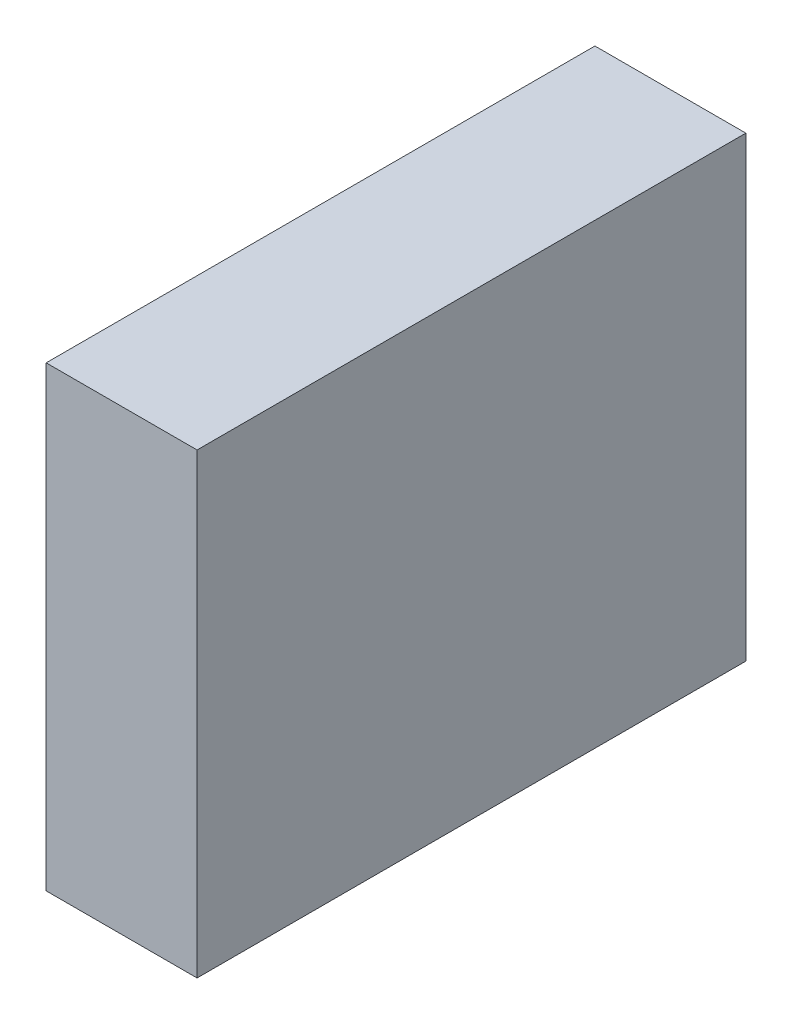
ISO-10303-21;
HEADER;
FILE_DESCRIPTION(('STEP AP214'),'2;1');
FILE_NAME('part.step','',(''),(''),'','','');
FILE_SCHEMA(('AUTOMOTIVE_DESIGN { 1 0 10303 214 1 1 1 1 }'));
ENDSEC;
DATA;
#1=APPLICATION_CONTEXT('core data for automotive mechanical design processes');
#2=APPLICATION_PROTOCOL_DEFINITION('international standard','automotive_design',2000,#1);
#3=PRODUCT_CONTEXT('',#1,'mechanical');
#4=PRODUCT('Part','Part','',(#3));
#5=PRODUCT_RELATED_PRODUCT_CATEGORY('part','',(#4));
#6=PRODUCT_DEFINITION_FORMATION('','',#4);
#7=PRODUCT_DEFINITION_CONTEXT('part definition',#1,'design');
#8=PRODUCT_DEFINITION('design','',#6,#7);
#9=PRODUCT_DEFINITION_SHAPE('','',#8);
#10=(LENGTH_UNIT() NAMED_UNIT(*) SI_UNIT(.MILLI.,.METRE.));
#11=(NAMED_UNIT(*) PLANE_ANGLE_UNIT() SI_UNIT($,.RADIAN.));
#12=(NAMED_UNIT(*) SI_UNIT($,.STERADIAN.) SOLID_ANGLE_UNIT());
#13=UNCERTAINTY_MEASURE_WITH_UNIT(LENGTH_MEASURE(1.E-05),#10,'distance_accuracy_value','');
#14=(GEOMETRIC_REPRESENTATION_CONTEXT(3) GLOBAL_UNCERTAINTY_ASSIGNED_CONTEXT((#13)) GLOBAL_UNIT_ASSIGNED_CONTEXT((#10,
#11,#12)) REPRESENTATION_CONTEXT('',''));
#15=CARTESIAN_POINT('',(0.,0.,0.));
#16=DIRECTION('',(0.,0.,1.));
#17=DIRECTION('',(1.,0.,0.));
#18=AXIS2_PLACEMENT_3D('',#15,#16,#17);
#19=CARTESIAN_POINT('',(31.50268,7.5605542771419,-0.000847924570265506));
#20=DIRECTION('',(1.,0.,0.));
#21=DIRECTION('',(0.,1.,0.));
#22=AXIS2_PLACEMENT_3D('',#19,#20,#21);
#23=PLANE('',#22);
#24=DIRECTION('',(0.,-4.37113885436334E-08,1.));
#25=VECTOR('',#24,1.);
#26=CARTESIAN_POINT('',(31.50268,8.0605543033719,-0.60084790271482));
#27=LINE('',#26,#25);
#28=CARTESIAN_POINT('',(31.50268,8.0605543033719,-0.60084791364257));
#29=VERTEX_POINT('',#28);
#30=CARTESIAN_POINT('',(31.50268,8.06055426403007,0.59915209672643));
#31=VERTEX_POINT('',#30);
#32=EDGE_CURVE('E89',#29,#31,#27,.T.);
#33=ORIENTED_EDGE('',*,*,#32,.T.);
#34=DIRECTION('',(0.,-1.,-4.37113884532334E-08));
#35=VECTOR('',#34,1.);
#36=CARTESIAN_POINT('',(31.50268,8.0605542509119,0.59915209728518));
#37=LINE('',#36,#35);
#38=CARTESIAN_POINT('',(31.50268,7.06055425091349,0.599152064129236));
#39=VERTEX_POINT('',#38);
#40=EDGE_CURVE('E72',#31,#39,#37,.T.);
#41=ORIENTED_EDGE('',*,*,#40,.T.);
#42=DIRECTION('',(0.,4.37113886339334E-08,-1.));
#43=VECTOR('',#42,1.);
#44=CARTESIAN_POINT('',(31.50268,7.0605543033719,-0.60084794642582));
#45=LINE('',#44,#43);
#46=CARTESIAN_POINT('',(31.50268,7.0605542771419,-0.600847946425917));
#47=VERTEX_POINT('',#46);
#48=EDGE_CURVE('E20',#39,#47,#45,.T.);
#49=ORIENTED_EDGE('',*,*,#48,.T.);
#50=DIRECTION('',(0.,1.,4.37113884532334E-08));
#51=VECTOR('',#50,1.);
#52=CARTESIAN_POINT('',(31.50268,8.0605543033719,-0.60084790271482));
#53=LINE('',#52,#51);
#54=EDGE_CURVE('E11',#47,#29,#53,.T.);
#55=ORIENTED_EDGE('',*,*,#54,.T.);
#56=EDGE_LOOP('',(#33,#41,#49,#55));
#57=FACE_BOUND('',#56,.T.);
#58=ADVANCED_FACE('F16',(#57),#23,.T.);
#59=CARTESIAN_POINT('',(31.50268,8.0605543033719,-0.60084790271482));
#60=DIRECTION('',(0.,-4.37113884532334E-08,1.));
#61=DIRECTION('',(-1.,-3.23774047741372E-10,0.));
#62=AXIS2_PLACEMENT_3D('',#59,#60,#61);
#63=PLANE('',#62);
#64=DIRECTION('',(1.,0.,0.));
#65=VECTOR('',#64,1.);
#66=CARTESIAN_POINT('',(31.50268,8.0605543033719,-0.60084790271482));
#67=LINE('',#66,#65);
#68=CARTESIAN_POINT('',(31.1726799999475,8.0605543033719,-0.60084791364257));
#69=VERTEX_POINT('',#68);
#70=EDGE_CURVE('E27',#69,#29,#67,.T.);
#71=ORIENTED_EDGE('',*,*,#70,.T.);
#72=ORIENTED_EDGE('',*,*,#54,.F.);
#73=DIRECTION('',(-1.,0.,0.));
#74=VECTOR('',#73,1.);
#75=CARTESIAN_POINT('',(31.50268,7.0605543033719,-0.60084794642582));
#76=LINE('',#75,#74);
#77=CARTESIAN_POINT('',(31.1726799999475,7.0605542902569,-0.600847946426014));
#78=VERTEX_POINT('',#77);
#79=EDGE_CURVE('E62',#47,#78,#76,.T.);
#80=ORIENTED_EDGE('',*,*,#79,.T.);
#81=DIRECTION('',(0.,1.,0.));
#82=VECTOR('',#81,1.);
#83=CARTESIAN_POINT('',(31.17268,7.5605542771419,-0.60084794642582));
#84=LINE('',#83,#82);
#85=EDGE_CURVE('E97',#78,#69,#84,.T.);
#86=ORIENTED_EDGE('',*,*,#85,.T.);
#87=EDGE_LOOP('',(#71,#72,#80,#86));
#88=FACE_BOUND('',#87,.T.);
#89=ADVANCED_FACE('F180',(#88),#63,.F.);
#90=CARTESIAN_POINT('',(31.50268,8.0605543033719,-0.60084790271482));
#91=DIRECTION('',(0.,-1.,-4.37113885436334E-08));
#92=DIRECTION('',(0.,4.37113885436334E-08,-1.));
#93=AXIS2_PLACEMENT_3D('',#90,#91,#92);
#94=PLANE('',#93);
#95=DIRECTION('',(1.,0.,0.));
#96=VECTOR('',#95,1.);
#97=CARTESIAN_POINT('',(31.50268,8.0605542509119,0.59915209728518));
#98=LINE('',#97,#96);
#99=CARTESIAN_POINT('',(31.1726799999475,8.06055426403007,0.59915209672643));
#100=VERTEX_POINT('',#99);
#101=EDGE_CURVE('E82',#100,#31,#98,.T.);
#102=ORIENTED_EDGE('',*,*,#101,.T.);
#103=ORIENTED_EDGE('',*,*,#32,.F.);
#104=ORIENTED_EDGE('',*,*,#70,.F.);
#105=DIRECTION('',(0.,0.,1.));
#106=VECTOR('',#105,1.);
#107=CARTESIAN_POINT('',(31.17268,8.0605543033719,-0.000847924570265418));
#108=LINE('',#107,#106);
#109=EDGE_CURVE('E92',#69,#100,#108,.T.);
#110=ORIENTED_EDGE('',*,*,#109,.T.);
#111=EDGE_LOOP('',(#102,#103,#104,#110));
#112=FACE_BOUND('',#111,.T.);
#113=ADVANCED_FACE('F93',(#112),#94,.F.);
#114=CARTESIAN_POINT('',(31.50268,8.0605542509119,0.59915209728518));
#115=DIRECTION('',(0.,4.37113884532334E-08,-1.));
#116=DIRECTION('',(-1.,0.,0.));
#117=AXIS2_PLACEMENT_3D('',#114,#115,#116);
#118=PLANE('',#117);
#119=DIRECTION('',(1.,0.,0.));
#120=VECTOR('',#119,1.);
#121=CARTESIAN_POINT('',(31.50268,7.06055425091823,0.59915205282918));
#122=LINE('',#121,#120);
#123=CARTESIAN_POINT('',(31.1726799999475,7.06055425091348,0.599152064129236));
#124=VERTEX_POINT('',#123);
#125=EDGE_CURVE('E123',#124,#39,#122,.T.);
#126=ORIENTED_EDGE('',*,*,#125,.T.);
#127=ORIENTED_EDGE('',*,*,#40,.F.);
#128=ORIENTED_EDGE('',*,*,#101,.F.);
#129=DIRECTION('',(0.,-1.,0.));
#130=VECTOR('',#129,1.);
#131=CARTESIAN_POINT('',(31.17268,7.5605542771419,0.59915209654018));
#132=LINE('',#131,#130);
#133=EDGE_CURVE('E85',#100,#124,#132,.T.);
#134=ORIENTED_EDGE('',*,*,#133,.T.);
#135=EDGE_LOOP('',(#126,#127,#128,#134));
#136=FACE_BOUND('',#135,.T.);
#137=ADVANCED_FACE('F18',(#136),#118,.F.);
#138=CARTESIAN_POINT('',(31.50268,7.0605543033719,-0.60084794642582));
#139=DIRECTION('',(0.,1.,4.37113886339334E-08));
#140=DIRECTION('',(1.,0.,5.12741281524178E-09));
#141=AXIS2_PLACEMENT_3D('',#138,#139,#140);
#142=PLANE('',#141);
#143=ORIENTED_EDGE('',*,*,#79,.F.);
#144=ORIENTED_EDGE('',*,*,#48,.F.);
#145=ORIENTED_EDGE('',*,*,#125,.F.);
#146=DIRECTION('',(0.,0.,-1.));
#147=VECTOR('',#146,1.);
#148=CARTESIAN_POINT('',(31.17268,7.0605542509119,-0.000847924570265584));
#149=LINE('',#148,#147);
#150=EDGE_CURVE('E101',#124,#78,#149,.T.);
#151=ORIENTED_EDGE('',*,*,#150,.T.);
#152=EDGE_LOOP('',(#143,#144,#145,#151));
#153=FACE_BOUND('',#152,.T.);
#154=ADVANCED_FACE('F132',(#153),#142,.F.);
#155=CARTESIAN_POINT('',(31.17268,7.5605542771419,-0.000847924570265501));
#156=DIRECTION('',(1.,0.,0.));
#157=DIRECTION('',(0.,1.,0.));
#158=AXIS2_PLACEMENT_3D('',#155,#156,#157);
#159=PLANE('',#158);
#160=ORIENTED_EDGE('',*,*,#133,.F.);
#161=ORIENTED_EDGE('',*,*,#109,.F.);
#162=ORIENTED_EDGE('',*,*,#85,.F.);
#163=ORIENTED_EDGE('',*,*,#150,.F.);
#164=EDGE_LOOP('',(#160,#161,#162,#163));
#165=FACE_BOUND('',#164,.T.);
#166=ADVANCED_FACE('F100',(#165),#159,.F.);
#167=CLOSED_SHELL('',(#58,#89,#113,#137,#154,#166));
#168=MANIFOLD_SOLID_BREP('B1',#167);
#169=ADVANCED_BREP_SHAPE_REPRESENTATION('',(#18,#168),#14);
#170=SHAPE_DEFINITION_REPRESENTATION(#9,#169);
ENDSEC;
END-ISO-10303-21;
